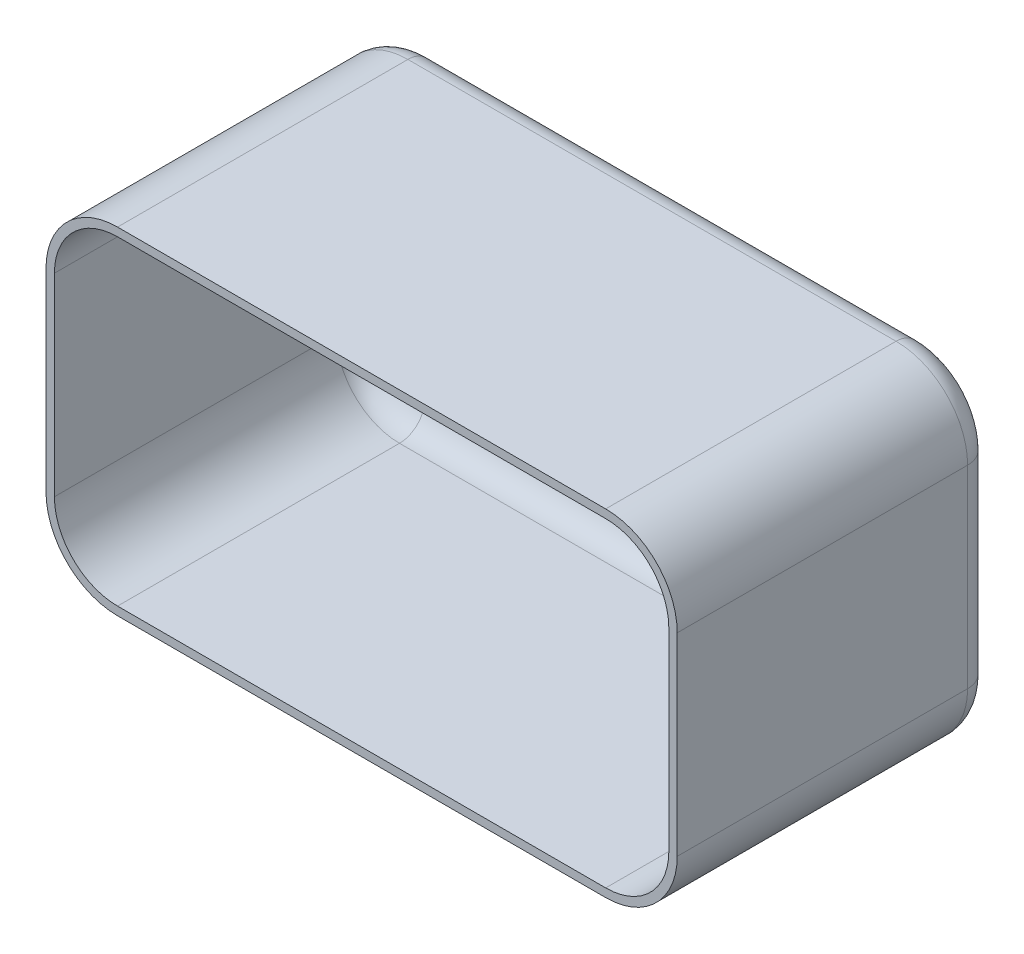
ISO-10303-21;
HEADER;
FILE_DESCRIPTION(('STEP AP214'),'2;1');
FILE_NAME('part.step','',(''),(''),'','','');
FILE_SCHEMA(('AUTOMOTIVE_DESIGN { 1 0 10303 214 1 1 1 1 }'));
ENDSEC;
DATA;
#1=APPLICATION_CONTEXT('core data for automotive mechanical design processes');
#2=APPLICATION_PROTOCOL_DEFINITION('international standard','automotive_design',2000,#1);
#3=PRODUCT_CONTEXT('',#1,'mechanical');
#4=PRODUCT('Part','Part','',(#3));
#5=PRODUCT_RELATED_PRODUCT_CATEGORY('part','',(#4));
#6=PRODUCT_DEFINITION_FORMATION('','',#4);
#7=PRODUCT_DEFINITION_CONTEXT('part definition',#1,'design');
#8=PRODUCT_DEFINITION('design','',#6,#7);
#9=PRODUCT_DEFINITION_SHAPE('','',#8);
#10=(LENGTH_UNIT() NAMED_UNIT(*) SI_UNIT(.MILLI.,.METRE.));
#11=(NAMED_UNIT(*) PLANE_ANGLE_UNIT() SI_UNIT($,.RADIAN.));
#12=(NAMED_UNIT(*) SI_UNIT($,.STERADIAN.) SOLID_ANGLE_UNIT());
#13=UNCERTAINTY_MEASURE_WITH_UNIT(LENGTH_MEASURE(1.E-05),#10,'distance_accuracy_value','');
#14=(GEOMETRIC_REPRESENTATION_CONTEXT(3) GLOBAL_UNCERTAINTY_ASSIGNED_CONTEXT((#13)) GLOBAL_UNIT_ASSIGNED_CONTEXT((#10,
#11,#12)) REPRESENTATION_CONTEXT('',''));
#15=CARTESIAN_POINT('',(0.,0.,0.));
#16=DIRECTION('',(0.,0.,1.));
#17=DIRECTION('',(1.,0.,0.));
#18=AXIS2_PLACEMENT_3D('',#15,#16,#17);
#19=CARTESIAN_POINT('',(-167.976460990203,129.257283518405,75.));
#20=DIRECTION('',(0.,0.,-1.));
#21=DIRECTION('',(-1.,0.,0.));
#22=AXIS2_PLACEMENT_3D('',#19,#20,#21);
#23=CYLINDRICAL_SURFACE('',#22,15.);
#24=DIRECTION('',(0.,0.,-1.));
#25=VECTOR('',#24,1.);
#26=CARTESIAN_POINT('',(-182.976460990203,129.257283518405,75.));
#27=LINE('',#26,#25);
#28=CARTESIAN_POINT('',(-182.976460990203,129.257283518405,75.));
#29=VERTEX_POINT('',#28);
#30=CARTESIAN_POINT('',(-182.976460990203,129.257283518405,7.99999999999999));
#31=VERTEX_POINT('',#30);
#32=EDGE_CURVE('E202',#29,#31,#27,.T.);
#33=ORIENTED_EDGE('',*,*,#32,.T.);
#34=CARTESIAN_POINT('',(-167.976460990203,129.257283518405,7.99999999999999));
#35=DIRECTION('',(0.,0.,-1.));
#36=DIRECTION('',(-1.,0.,0.));
#37=AXIS2_PLACEMENT_3D('',#34,#35,#36);
#38=CIRCLE('',#37,15.);
#39=CARTESIAN_POINT('',(-167.976460990203,144.257283518405,7.99999999999999));
#40=VERTEX_POINT('',#39);
#41=EDGE_CURVE('E347',#31,#40,#38,.T.);
#42=ORIENTED_EDGE('',*,*,#41,.T.);
#43=DIRECTION('',(0.,0.,-1.));
#44=VECTOR('',#43,1.);
#45=CARTESIAN_POINT('',(-167.976460990203,144.257283518405,75.));
#46=LINE('',#45,#44);
#47=CARTESIAN_POINT('',(-167.976460990203,144.257283518405,75.));
#48=VERTEX_POINT('',#47);
#49=EDGE_CURVE('E205',#48,#40,#46,.T.);
#50=ORIENTED_EDGE('',*,*,#49,.F.);
#51=CARTESIAN_POINT('',(-167.976460990203,129.257283518405,75.));
#52=DIRECTION('',(0.,0.,1.));
#53=DIRECTION('',(1.,0.,0.));
#54=AXIS2_PLACEMENT_3D('',#51,#52,#53);
#55=CIRCLE('',#54,15.);
#56=EDGE_CURVE('E200',#48,#29,#55,.T.);
#57=ORIENTED_EDGE('',*,*,#56,.T.);
#58=EDGE_LOOP('',(#33,#42,#50,#57));
#59=FACE_BOUND('',#58,.T.);
#60=ADVANCED_FACE('F35',(#59),#23,.F.);
#61=CARTESIAN_POINT('',(-182.976460990203,129.257283518405,75.));
#62=DIRECTION('',(1.,0.,0.));
#63=DIRECTION('',(0.,0.,-1.));
#64=AXIS2_PLACEMENT_3D('',#61,#62,#63);
#65=PLANE('',#64);
#66=DIRECTION('',(0.,0.,-1.));
#67=VECTOR('',#66,1.);
#68=CARTESIAN_POINT('',(-182.976460990203,83.257283518405,75.));
#69=LINE('',#68,#67);
#70=CARTESIAN_POINT('',(-182.976460990203,83.257283518405,75.));
#71=VERTEX_POINT('',#70);
#72=CARTESIAN_POINT('',(-182.976460990203,83.257283518405,7.99999999999999));
#73=VERTEX_POINT('',#72);
#74=EDGE_CURVE('E219',#71,#73,#69,.T.);
#75=ORIENTED_EDGE('',*,*,#74,.T.);
#76=DIRECTION('',(0.,1.,0.));
#77=VECTOR('',#76,1.);
#78=CARTESIAN_POINT('',(-182.976460990203,129.257283518405,7.99999999999999));
#79=LINE('',#78,#77);
#80=EDGE_CURVE('E217',#73,#31,#79,.T.);
#81=ORIENTED_EDGE('',*,*,#80,.T.);
#82=ORIENTED_EDGE('',*,*,#32,.F.);
#83=DIRECTION('',(0.,-1.,0.));
#84=VECTOR('',#83,1.);
#85=CARTESIAN_POINT('',(-182.976460990203,129.257283518405,75.));
#86=LINE('',#85,#84);
#87=EDGE_CURVE('E209',#29,#71,#86,.T.);
#88=ORIENTED_EDGE('',*,*,#87,.T.);
#89=EDGE_LOOP('',(#75,#81,#82,#88));
#90=FACE_BOUND('',#89,.T.);
#91=ADVANCED_FACE('F214',(#90),#65,.T.);
#92=CARTESIAN_POINT('',(-167.976460990203,83.257283518405,75.));
#93=DIRECTION('',(0.,0.,-1.));
#94=DIRECTION('',(-1.,0.,0.));
#95=AXIS2_PLACEMENT_3D('',#92,#93,#94);
#96=CYLINDRICAL_SURFACE('',#95,15.);
#97=DIRECTION('',(0.,0.,-1.));
#98=VECTOR('',#97,1.);
#99=CARTESIAN_POINT('',(-167.976460990203,68.257283518405,75.));
#100=LINE('',#99,#98);
#101=CARTESIAN_POINT('',(-167.976460990203,68.257283518405,75.));
#102=VERTEX_POINT('',#101);
#103=CARTESIAN_POINT('',(-167.976460990203,68.257283518405,7.99999999999999));
#104=VERTEX_POINT('',#103);
#105=EDGE_CURVE('E249',#102,#104,#100,.T.);
#106=ORIENTED_EDGE('',*,*,#105,.T.);
#107=CARTESIAN_POINT('',(-167.976460990203,83.257283518405,7.99999999999999));
#108=DIRECTION('',(0.,0.,-1.));
#109=DIRECTION('',(-1.,0.,0.));
#110=AXIS2_PLACEMENT_3D('',#107,#108,#109);
#111=CIRCLE('',#110,15.);
#112=EDGE_CURVE('E350',#104,#73,#111,.T.);
#113=ORIENTED_EDGE('',*,*,#112,.T.);
#114=ORIENTED_EDGE('',*,*,#74,.F.);
#115=CARTESIAN_POINT('',(-167.976460990203,83.257283518405,75.));
#116=DIRECTION('',(0.,0.,1.));
#117=DIRECTION('',(1.,0.,0.));
#118=AXIS2_PLACEMENT_3D('',#115,#116,#117);
#119=CIRCLE('',#118,15.);
#120=EDGE_CURVE('E224',#71,#102,#119,.T.);
#121=ORIENTED_EDGE('',*,*,#120,.T.);
#122=EDGE_LOOP('',(#106,#113,#114,#121));
#123=FACE_BOUND('',#122,.T.);
#124=ADVANCED_FACE('F453',(#123),#96,.F.);
#125=CARTESIAN_POINT('',(-167.976460990203,68.257283518405,75.));
#126=DIRECTION('',(0.,1.,0.));
#127=DIRECTION('',(0.,0.,1.));
#128=AXIS2_PLACEMENT_3D('',#125,#126,#127);
#129=PLANE('',#128);
#130=DIRECTION('',(0.,0.,-1.));
#131=VECTOR('',#130,1.);
#132=CARTESIAN_POINT('',(-51.9764609902031,68.257283518405,75.));
#133=LINE('',#132,#131);
#134=CARTESIAN_POINT('',(-51.9764609902031,68.257283518405,75.));
#135=VERTEX_POINT('',#134);
#136=CARTESIAN_POINT('',(-51.9764609902031,68.257283518405,7.99999999999999));
#137=VERTEX_POINT('',#136);
#138=EDGE_CURVE('E247',#135,#137,#133,.T.);
#139=ORIENTED_EDGE('',*,*,#138,.T.);
#140=DIRECTION('',(-1.,0.,0.));
#141=VECTOR('',#140,1.);
#142=CARTESIAN_POINT('',(-167.976460990203,68.257283518405,7.99999999999999));
#143=LINE('',#142,#141);
#144=EDGE_CURVE('E352',#137,#104,#143,.T.);
#145=ORIENTED_EDGE('',*,*,#144,.T.);
#146=ORIENTED_EDGE('',*,*,#105,.F.);
#147=DIRECTION('',(1.,0.,0.));
#148=VECTOR('',#147,1.);
#149=CARTESIAN_POINT('',(-167.976460990203,68.257283518405,75.));
#150=LINE('',#149,#148);
#151=EDGE_CURVE('E226',#102,#135,#150,.T.);
#152=ORIENTED_EDGE('',*,*,#151,.T.);
#153=EDGE_LOOP('',(#139,#145,#146,#152));
#154=FACE_BOUND('',#153,.T.);
#155=ADVANCED_FACE('F580',(#154),#129,.T.);
#156=CARTESIAN_POINT('',(-51.9764609902031,83.257283518405,75.));
#157=DIRECTION('',(0.,0.,-1.));
#158=DIRECTION('',(-1.,0.,0.));
#159=AXIS2_PLACEMENT_3D('',#156,#157,#158);
#160=CYLINDRICAL_SURFACE('',#159,15.);
#161=DIRECTION('',(0.,0.,-1.));
#162=VECTOR('',#161,1.);
#163=CARTESIAN_POINT('',(-36.9764609902031,83.257283518405,75.));
#164=LINE('',#163,#162);
#165=CARTESIAN_POINT('',(-36.9764609902031,83.257283518405,75.));
#166=VERTEX_POINT('',#165);
#167=CARTESIAN_POINT('',(-36.9764609902031,83.257283518405,7.99999999999999));
#168=VERTEX_POINT('',#167);
#169=EDGE_CURVE('E245',#166,#168,#164,.T.);
#170=ORIENTED_EDGE('',*,*,#169,.T.);
#171=CARTESIAN_POINT('',(-51.9764609902031,83.257283518405,7.99999999999999));
#172=DIRECTION('',(0.,0.,-1.));
#173=DIRECTION('',(-1.,0.,0.));
#174=AXIS2_PLACEMENT_3D('',#171,#172,#173);
#175=CIRCLE('',#174,15.);
#176=EDGE_CURVE('E57',#168,#137,#175,.T.);
#177=ORIENTED_EDGE('',*,*,#176,.T.);
#178=ORIENTED_EDGE('',*,*,#138,.F.);
#179=CARTESIAN_POINT('',(-51.9764609902031,83.257283518405,75.));
#180=DIRECTION('',(0.,0.,1.));
#181=DIRECTION('',(1.,0.,0.));
#182=AXIS2_PLACEMENT_3D('',#179,#180,#181);
#183=CIRCLE('',#182,15.);
#184=EDGE_CURVE('E230',#135,#166,#183,.T.);
#185=ORIENTED_EDGE('',*,*,#184,.T.);
#186=EDGE_LOOP('',(#170,#177,#178,#185));
#187=FACE_BOUND('',#186,.T.);
#188=ADVANCED_FACE('F429',(#187),#160,.F.);
#189=CARTESIAN_POINT('',(-36.9764609902031,129.257283518405,75.));
#190=DIRECTION('',(-1.,0.,0.));
#191=DIRECTION('',(0.,-1.,0.));
#192=AXIS2_PLACEMENT_3D('',#189,#190,#191);
#193=PLANE('',#192);
#194=DIRECTION('',(0.,0.,-1.));
#195=VECTOR('',#194,1.);
#196=CARTESIAN_POINT('',(-36.9764609902031,129.257283518405,75.));
#197=LINE('',#196,#195);
#198=CARTESIAN_POINT('',(-36.9764609902031,129.257283518405,75.));
#199=VERTEX_POINT('',#198);
#200=CARTESIAN_POINT('',(-36.9764609902031,129.257283518405,7.99999999999999));
#201=VERTEX_POINT('',#200);
#202=EDGE_CURVE('E243',#199,#201,#197,.T.);
#203=ORIENTED_EDGE('',*,*,#202,.T.);
#204=DIRECTION('',(0.,-1.,0.));
#205=VECTOR('',#204,1.);
#206=CARTESIAN_POINT('',(-36.9764609902031,129.257283518405,7.99999999999999));
#207=LINE('',#206,#205);
#208=EDGE_CURVE('E11',#201,#168,#207,.T.);
#209=ORIENTED_EDGE('',*,*,#208,.T.);
#210=ORIENTED_EDGE('',*,*,#169,.F.);
#211=DIRECTION('',(0.,1.,0.));
#212=VECTOR('',#211,1.);
#213=CARTESIAN_POINT('',(-36.9764609902031,129.257283518405,75.));
#214=LINE('',#213,#212);
#215=EDGE_CURVE('E232',#166,#199,#214,.T.);
#216=ORIENTED_EDGE('',*,*,#215,.T.);
#217=EDGE_LOOP('',(#203,#209,#210,#216));
#218=FACE_BOUND('',#217,.T.);
#219=ADVANCED_FACE('F428',(#218),#193,.T.);
#220=CARTESIAN_POINT('',(-51.9764609902031,129.257283518405,75.));
#221=DIRECTION('',(0.,0.,-1.));
#222=DIRECTION('',(-1.,0.,0.));
#223=AXIS2_PLACEMENT_3D('',#220,#221,#222);
#224=CYLINDRICAL_SURFACE('',#223,15.);
#225=DIRECTION('',(0.,0.,-1.));
#226=VECTOR('',#225,1.);
#227=CARTESIAN_POINT('',(-51.9764609902031,144.257283518405,75.));
#228=LINE('',#227,#226);
#229=CARTESIAN_POINT('',(-51.9764609902031,144.257283518405,75.));
#230=VERTEX_POINT('',#229);
#231=CARTESIAN_POINT('',(-51.9764609902031,144.257283518405,7.99999999999999));
#232=VERTEX_POINT('',#231);
#233=EDGE_CURVE('E240',#230,#232,#228,.T.);
#234=ORIENTED_EDGE('',*,*,#233,.T.);
#235=CARTESIAN_POINT('',(-51.9764609902031,129.257283518405,7.99999999999999));
#236=DIRECTION('',(0.,0.,-1.));
#237=DIRECTION('',(-1.,0.,0.));
#238=AXIS2_PLACEMENT_3D('',#235,#236,#237);
#239=CIRCLE('',#238,15.);
#240=EDGE_CURVE('E325',#232,#201,#239,.T.);
#241=ORIENTED_EDGE('',*,*,#240,.T.);
#242=ORIENTED_EDGE('',*,*,#202,.F.);
#243=CARTESIAN_POINT('',(-51.9764609902031,129.257283518405,75.));
#244=DIRECTION('',(0.,0.,1.));
#245=DIRECTION('',(-1.,0.,0.));
#246=AXIS2_PLACEMENT_3D('',#243,#244,#245);
#247=CIRCLE('',#246,15.);
#248=EDGE_CURVE('E234',#199,#230,#247,.T.);
#249=ORIENTED_EDGE('',*,*,#248,.T.);
#250=EDGE_LOOP('',(#234,#241,#242,#249));
#251=FACE_BOUND('',#250,.T.);
#252=ADVANCED_FACE('F423',(#251),#224,.F.);
#253=CARTESIAN_POINT('',(-167.976460990203,144.257283518405,75.));
#254=DIRECTION('',(0.,-1.,0.));
#255=DIRECTION('',(0.,0.,-1.));
#256=AXIS2_PLACEMENT_3D('',#253,#254,#255);
#257=PLANE('',#256);
#258=ORIENTED_EDGE('',*,*,#49,.T.);
#259=DIRECTION('',(1.,0.,0.));
#260=VECTOR('',#259,1.);
#261=CARTESIAN_POINT('',(-167.976460990203,144.257283518405,7.99999999999999));
#262=LINE('',#261,#260);
#263=EDGE_CURVE('E345',#40,#232,#262,.T.);
#264=ORIENTED_EDGE('',*,*,#263,.T.);
#265=ORIENTED_EDGE('',*,*,#233,.F.);
#266=DIRECTION('',(-1.,0.,0.));
#267=VECTOR('',#266,1.);
#268=CARTESIAN_POINT('',(-167.976460990203,144.257283518405,75.));
#269=LINE('',#268,#267);
#270=EDGE_CURVE('E237',#230,#48,#269,.T.);
#271=ORIENTED_EDGE('',*,*,#270,.T.);
#272=EDGE_LOOP('',(#258,#264,#265,#271));
#273=FACE_BOUND('',#272,.T.);
#274=ADVANCED_FACE('F421',(#273),#257,.T.);
#275=CARTESIAN_POINT('',(-51.9764609902031,129.257283518405,75.));
#276=DIRECTION('',(0.,0.,-1.));
#277=DIRECTION('',(-1.,0.,0.));
#278=AXIS2_PLACEMENT_3D('',#275,#276,#277);
#279=PLANE('',#278);
#280=CARTESIAN_POINT('',(-51.9764609902031,129.257283518405,75.));
#281=DIRECTION('',(0.,0.,1.));
#282=DIRECTION('',(-1.,0.,0.));
#283=AXIS2_PLACEMENT_3D('',#280,#281,#282);
#284=CIRCLE('',#283,17.);
#285=CARTESIAN_POINT('',(-34.9764609902031,129.257283518405,75.));
#286=VERTEX_POINT('',#285);
#287=CARTESIAN_POINT('',(-51.9764609902031,146.257283518405,75.));
#288=VERTEX_POINT('',#287);
#289=EDGE_CURVE('E218',#286,#288,#284,.T.);
#290=ORIENTED_EDGE('',*,*,#289,.T.);
#291=DIRECTION('',(-1.,0.,0.));
#292=VECTOR('',#291,1.);
#293=CARTESIAN_POINT('',(-167.976460990203,146.257283518405,75.));
#294=LINE('',#293,#292);
#295=CARTESIAN_POINT('',(-167.976460990203,146.257283518405,75.));
#296=VERTEX_POINT('',#295);
#297=EDGE_CURVE('E255',#288,#296,#294,.T.);
#298=ORIENTED_EDGE('',*,*,#297,.T.);
#299=CARTESIAN_POINT('',(-167.976460990203,129.257283518405,75.));
#300=DIRECTION('',(0.,0.,1.));
#301=DIRECTION('',(1.,0.,0.));
#302=AXIS2_PLACEMENT_3D('',#299,#300,#301);
#303=CIRCLE('',#302,17.);
#304=CARTESIAN_POINT('',(-184.976460990203,129.257283518405,75.));
#305=VERTEX_POINT('',#304);
#306=EDGE_CURVE('E257',#296,#305,#303,.T.);
#307=ORIENTED_EDGE('',*,*,#306,.T.);
#308=DIRECTION('',(0.,-1.,0.));
#309=VECTOR('',#308,1.);
#310=CARTESIAN_POINT('',(-184.976460990203,129.257283518405,75.));
#311=LINE('',#310,#309);
#312=CARTESIAN_POINT('',(-184.976460990203,83.257283518405,75.));
#313=VERTEX_POINT('',#312);
#314=EDGE_CURVE('E259',#305,#313,#311,.T.);
#315=ORIENTED_EDGE('',*,*,#314,.T.);
#316=CARTESIAN_POINT('',(-167.976460990203,83.257283518405,75.));
#317=DIRECTION('',(0.,0.,1.));
#318=DIRECTION('',(1.,0.,0.));
#319=AXIS2_PLACEMENT_3D('',#316,#317,#318);
#320=CIRCLE('',#319,17.);
#321=CARTESIAN_POINT('',(-167.976460990203,66.257283518405,75.));
#322=VERTEX_POINT('',#321);
#323=EDGE_CURVE('E261',#313,#322,#320,.T.);
#324=ORIENTED_EDGE('',*,*,#323,.T.);
#325=DIRECTION('',(1.,0.,0.));
#326=VECTOR('',#325,1.);
#327=CARTESIAN_POINT('',(-167.976460990203,66.257283518405,75.));
#328=LINE('',#327,#326);
#329=CARTESIAN_POINT('',(-51.9764609902031,66.257283518405,75.));
#330=VERTEX_POINT('',#329);
#331=EDGE_CURVE('E263',#322,#330,#328,.T.);
#332=ORIENTED_EDGE('',*,*,#331,.T.);
#333=CARTESIAN_POINT('',(-51.9764609902031,83.257283518405,75.));
#334=DIRECTION('',(0.,0.,1.));
#335=DIRECTION('',(1.,0.,0.));
#336=AXIS2_PLACEMENT_3D('',#333,#334,#335);
#337=CIRCLE('',#336,17.);
#338=CARTESIAN_POINT('',(-34.9764609902031,83.257283518405,75.));
#339=VERTEX_POINT('',#338);
#340=EDGE_CURVE('E265',#330,#339,#337,.T.);
#341=ORIENTED_EDGE('',*,*,#340,.T.);
#342=DIRECTION('',(0.,1.,0.));
#343=VECTOR('',#342,1.);
#344=CARTESIAN_POINT('',(-34.9764609902031,129.257283518405,75.));
#345=LINE('',#344,#343);
#346=EDGE_CURVE('E267',#339,#286,#345,.T.);
#347=ORIENTED_EDGE('',*,*,#346,.T.);
#348=EDGE_LOOP('',(#290,#298,#307,#315,#324,#332,#341,#347));
#349=FACE_BOUND('',#348,.T.);
#350=ORIENTED_EDGE('',*,*,#56,.F.);
#351=ORIENTED_EDGE('',*,*,#270,.F.);
#352=ORIENTED_EDGE('',*,*,#248,.F.);
#353=ORIENTED_EDGE('',*,*,#215,.F.);
#354=ORIENTED_EDGE('',*,*,#184,.F.);
#355=ORIENTED_EDGE('',*,*,#151,.F.);
#356=ORIENTED_EDGE('',*,*,#120,.F.);
#357=ORIENTED_EDGE('',*,*,#87,.F.);
#358=EDGE_LOOP('',(#350,#351,#352,#353,#354,#355,#356,#357));
#359=FACE_BOUND('',#358,.T.);
#360=ADVANCED_FACE('F222',(#349,#359),#279,.F.);
#361=CARTESIAN_POINT('',(-51.9764609902031,129.257283518405,0.));
#362=DIRECTION('',(0.,0.,-1.));
#363=DIRECTION('',(-1.,0.,0.));
#364=AXIS2_PLACEMENT_3D('',#361,#362,#363);
#365=PLANE('',#364);
#366=DIRECTION('',(0.,1.,0.));
#367=VECTOR('',#366,1.);
#368=CARTESIAN_POINT('',(-40.9764609902031,83.257283518405,0.));
#369=LINE('',#368,#367);
#370=CARTESIAN_POINT('',(-40.9764609902031,129.257283518405,0.));
#371=VERTEX_POINT('',#370);
#372=CARTESIAN_POINT('',(-40.9764609902031,83.257283518405,0.));
#373=VERTEX_POINT('',#372);
#374=EDGE_CURVE('E296',#371,#373,#369,.F.);
#375=ORIENTED_EDGE('',*,*,#374,.T.);
#376=CARTESIAN_POINT('',(-51.9764609902031,83.257283518405,0.));
#377=DIRECTION('',(0.,0.,-1.));
#378=DIRECTION('',(-1.,0.,0.));
#379=AXIS2_PLACEMENT_3D('',#376,#377,#378);
#380=CIRCLE('',#379,11.);
#381=CARTESIAN_POINT('',(-51.9764609902031,72.257283518405,0.));
#382=VERTEX_POINT('',#381);
#383=EDGE_CURVE('E310',#373,#382,#380,.T.);
#384=ORIENTED_EDGE('',*,*,#383,.T.);
#385=DIRECTION('',(1.,0.,0.));
#386=VECTOR('',#385,1.);
#387=CARTESIAN_POINT('',(-167.976460990203,72.257283518405,0.));
#388=LINE('',#387,#386);
#389=CARTESIAN_POINT('',(-167.976460990203,72.257283518405,0.));
#390=VERTEX_POINT('',#389);
#391=EDGE_CURVE('E308',#382,#390,#388,.F.);
#392=ORIENTED_EDGE('',*,*,#391,.T.);
#393=CARTESIAN_POINT('',(-167.976460990203,83.257283518405,0.));
#394=DIRECTION('',(0.,0.,-1.));
#395=DIRECTION('',(-1.,0.,0.));
#396=AXIS2_PLACEMENT_3D('',#393,#394,#395);
#397=CIRCLE('',#396,11.);
#398=CARTESIAN_POINT('',(-178.976460990203,83.257283518405,0.));
#399=VERTEX_POINT('',#398);
#400=EDGE_CURVE('E306',#390,#399,#397,.T.);
#401=ORIENTED_EDGE('',*,*,#400,.T.);
#402=DIRECTION('',(0.,-1.,0.));
#403=VECTOR('',#402,1.);
#404=CARTESIAN_POINT('',(-178.976460990203,129.257283518405,0.));
#405=LINE('',#404,#403);
#406=CARTESIAN_POINT('',(-178.976460990203,129.257283518405,0.));
#407=VERTEX_POINT('',#406);
#408=EDGE_CURVE('E304',#399,#407,#405,.F.);
#409=ORIENTED_EDGE('',*,*,#408,.T.);
#410=CARTESIAN_POINT('',(-167.976460990203,129.257283518405,0.));
#411=DIRECTION('',(0.,0.,-1.));
#412=DIRECTION('',(-1.,0.,0.));
#413=AXIS2_PLACEMENT_3D('',#410,#411,#412);
#414=CIRCLE('',#413,11.);
#415=CARTESIAN_POINT('',(-167.976460990203,140.257283518405,0.));
#416=VERTEX_POINT('',#415);
#417=EDGE_CURVE('E302',#407,#416,#414,.T.);
#418=ORIENTED_EDGE('',*,*,#417,.T.);
#419=DIRECTION('',(-1.,0.,0.));
#420=VECTOR('',#419,1.);
#421=CARTESIAN_POINT('',(-51.9764609902031,140.257283518405,0.));
#422=LINE('',#421,#420);
#423=CARTESIAN_POINT('',(-51.9764609902031,140.257283518405,0.));
#424=VERTEX_POINT('',#423);
#425=EDGE_CURVE('E300',#416,#424,#422,.F.);
#426=ORIENTED_EDGE('',*,*,#425,.T.);
#427=CARTESIAN_POINT('',(-51.9764609902031,129.257283518405,0.));
#428=DIRECTION('',(0.,0.,-1.));
#429=DIRECTION('',(-1.,0.,0.));
#430=AXIS2_PLACEMENT_3D('',#427,#428,#429);
#431=CIRCLE('',#430,11.);
#432=EDGE_CURVE('E298',#424,#371,#431,.T.);
#433=ORIENTED_EDGE('',*,*,#432,.T.);
#434=EDGE_LOOP('',(#375,#384,#392,#401,#409,#418,#426,#433));
#435=FACE_BOUND('',#434,.T.);
#436=ADVANCED_FACE('F459',(#435),#365,.T.);
#437=CARTESIAN_POINT('',(-51.9764609902031,129.257283518405,75.));
#438=DIRECTION('',(0.,0.,-1.));
#439=DIRECTION('',(-1.,0.,0.));
#440=AXIS2_PLACEMENT_3D('',#437,#438,#439);
#441=CYLINDRICAL_SURFACE('',#440,17.);
#442=DIRECTION('',(0.,0.,-1.));
#443=VECTOR('',#442,1.);
#444=CARTESIAN_POINT('',(-34.9764609902031,129.257283518405,75.));
#445=LINE('',#444,#443);
#446=CARTESIAN_POINT('',(-34.9764609902031,129.257283518405,6.00000000000001));
#447=VERTEX_POINT('',#446);
#448=EDGE_CURVE('E269',#286,#447,#445,.T.);
#449=ORIENTED_EDGE('',*,*,#448,.T.);
#450=CARTESIAN_POINT('',(-51.9764609902031,129.257283518405,6.00000000000001));
#451=DIRECTION('',(0.,0.,-1.));
#452=DIRECTION('',(-1.,0.,0.));
#453=AXIS2_PLACEMENT_3D('',#450,#451,#452);
#454=CIRCLE('',#453,17.);
#455=CARTESIAN_POINT('',(-51.9764609902031,146.257283518405,6.00000000000001));
#456=VERTEX_POINT('',#455);
#457=EDGE_CURVE('E323',#447,#456,#454,.F.);
#458=ORIENTED_EDGE('',*,*,#457,.T.);
#459=DIRECTION('',(0.,0.,-1.));
#460=VECTOR('',#459,1.);
#461=CARTESIAN_POINT('',(-51.9764609902031,146.257283518405,75.));
#462=LINE('',#461,#460);
#463=EDGE_CURVE('E290',#288,#456,#462,.T.);
#464=ORIENTED_EDGE('',*,*,#463,.F.);
#465=ORIENTED_EDGE('',*,*,#289,.F.);
#466=EDGE_LOOP('',(#449,#458,#464,#465));
#467=FACE_BOUND('',#466,.T.);
#468=ADVANCED_FACE('F463',(#467),#441,.T.);
#469=CARTESIAN_POINT('',(-167.976460990203,146.257283518405,75.));
#470=DIRECTION('',(0.,-1.,0.));
#471=DIRECTION('',(0.,0.,-1.));
#472=AXIS2_PLACEMENT_3D('',#469,#470,#471);
#473=PLANE('',#472);
#474=ORIENTED_EDGE('',*,*,#463,.T.);
#475=DIRECTION('',(-1.,0.,0.));
#476=VECTOR('',#475,1.);
#477=CARTESIAN_POINT('',(-167.976460990203,146.257283518405,6.00000000000001));
#478=LINE('',#477,#476);
#479=CARTESIAN_POINT('',(-167.976460990203,146.257283518405,6.00000000000001));
#480=VERTEX_POINT('',#479);
#481=EDGE_CURVE('E321',#456,#480,#478,.T.);
#482=ORIENTED_EDGE('',*,*,#481,.T.);
#483=DIRECTION('',(0.,0.,-1.));
#484=VECTOR('',#483,1.);
#485=CARTESIAN_POINT('',(-167.976460990203,146.257283518405,75.));
#486=LINE('',#485,#484);
#487=EDGE_CURVE('E287',#296,#480,#486,.T.);
#488=ORIENTED_EDGE('',*,*,#487,.F.);
#489=ORIENTED_EDGE('',*,*,#297,.F.);
#490=EDGE_LOOP('',(#474,#482,#488,#489));
#491=FACE_BOUND('',#490,.T.);
#492=ADVANCED_FACE('F488',(#491),#473,.F.);
#493=CARTESIAN_POINT('',(-167.976460990203,129.257283518405,75.));
#494=DIRECTION('',(0.,0.,-1.));
#495=DIRECTION('',(-1.,0.,0.));
#496=AXIS2_PLACEMENT_3D('',#493,#494,#495);
#497=CYLINDRICAL_SURFACE('',#496,17.);
#498=ORIENTED_EDGE('',*,*,#487,.T.);
#499=CARTESIAN_POINT('',(-167.976460990203,129.257283518405,6.00000000000001));
#500=DIRECTION('',(0.,0.,-1.));
#501=DIRECTION('',(-1.,0.,0.));
#502=AXIS2_PLACEMENT_3D('',#499,#500,#501);
#503=CIRCLE('',#502,17.);
#504=CARTESIAN_POINT('',(-184.976460990203,129.257283518405,6.00000000000001));
#505=VERTEX_POINT('',#504);
#506=EDGE_CURVE('E319',#480,#505,#503,.F.);
#507=ORIENTED_EDGE('',*,*,#506,.T.);
#508=DIRECTION('',(0.,0.,-1.));
#509=VECTOR('',#508,1.);
#510=CARTESIAN_POINT('',(-184.976460990203,129.257283518405,75.));
#511=LINE('',#510,#509);
#512=EDGE_CURVE('E284',#305,#505,#511,.T.);
#513=ORIENTED_EDGE('',*,*,#512,.F.);
#514=ORIENTED_EDGE('',*,*,#306,.F.);
#515=EDGE_LOOP('',(#498,#507,#513,#514));
#516=FACE_BOUND('',#515,.T.);
#517=ADVANCED_FACE('F484',(#516),#497,.T.);
#518=CARTESIAN_POINT('',(-184.976460990203,129.257283518405,75.));
#519=DIRECTION('',(1.,0.,0.));
#520=DIRECTION('',(0.,0.,-1.));
#521=AXIS2_PLACEMENT_3D('',#518,#519,#520);
#522=PLANE('',#521);
#523=ORIENTED_EDGE('',*,*,#512,.T.);
#524=DIRECTION('',(0.,-1.,0.));
#525=VECTOR('',#524,1.);
#526=CARTESIAN_POINT('',(-184.976460990203,83.257283518405,6.00000000000001));
#527=LINE('',#526,#525);
#528=CARTESIAN_POINT('',(-184.976460990203,83.257283518405,6.00000000000001));
#529=VERTEX_POINT('',#528);
#530=EDGE_CURVE('E317',#505,#529,#527,.T.);
#531=ORIENTED_EDGE('',*,*,#530,.T.);
#532=DIRECTION('',(0.,0.,-1.));
#533=VECTOR('',#532,1.);
#534=CARTESIAN_POINT('',(-184.976460990203,83.257283518405,75.));
#535=LINE('',#534,#533);
#536=EDGE_CURVE('E281',#313,#529,#535,.T.);
#537=ORIENTED_EDGE('',*,*,#536,.F.);
#538=ORIENTED_EDGE('',*,*,#314,.F.);
#539=EDGE_LOOP('',(#523,#531,#537,#538));
#540=FACE_BOUND('',#539,.T.);
#541=ADVANCED_FACE('F480',(#540),#522,.F.);
#542=CARTESIAN_POINT('',(-167.976460990203,83.257283518405,75.));
#543=DIRECTION('',(0.,0.,-1.));
#544=DIRECTION('',(-1.,0.,0.));
#545=AXIS2_PLACEMENT_3D('',#542,#543,#544);
#546=CYLINDRICAL_SURFACE('',#545,17.);
#547=ORIENTED_EDGE('',*,*,#536,.T.);
#548=CARTESIAN_POINT('',(-167.976460990203,83.257283518405,6.00000000000001));
#549=DIRECTION('',(0.,0.,-1.));
#550=DIRECTION('',(-1.,0.,0.));
#551=AXIS2_PLACEMENT_3D('',#548,#549,#550);
#552=CIRCLE('',#551,17.);
#553=CARTESIAN_POINT('',(-167.976460990203,66.257283518405,6.00000000000001));
#554=VERTEX_POINT('',#553);
#555=EDGE_CURVE('E315',#529,#554,#552,.F.);
#556=ORIENTED_EDGE('',*,*,#555,.T.);
#557=DIRECTION('',(0.,0.,-1.));
#558=VECTOR('',#557,1.);
#559=CARTESIAN_POINT('',(-167.976460990203,66.257283518405,75.));
#560=LINE('',#559,#558);
#561=EDGE_CURVE('E278',#322,#554,#560,.T.);
#562=ORIENTED_EDGE('',*,*,#561,.F.);
#563=ORIENTED_EDGE('',*,*,#323,.F.);
#564=EDGE_LOOP('',(#547,#556,#562,#563));
#565=FACE_BOUND('',#564,.T.);
#566=ADVANCED_FACE('F476',(#565),#546,.T.);
#567=CARTESIAN_POINT('',(-167.976460990203,66.257283518405,75.));
#568=DIRECTION('',(0.,1.,0.));
#569=DIRECTION('',(-1.,0.,0.));
#570=AXIS2_PLACEMENT_3D('',#567,#568,#569);
#571=PLANE('',#570);
#572=ORIENTED_EDGE('',*,*,#561,.T.);
#573=DIRECTION('',(1.,0.,0.));
#574=VECTOR('',#573,1.);
#575=CARTESIAN_POINT('',(-51.9764609902031,66.257283518405,6.00000000000001));
#576=LINE('',#575,#574);
#577=CARTESIAN_POINT('',(-51.9764609902031,66.257283518405,6.00000000000001));
#578=VERTEX_POINT('',#577);
#579=EDGE_CURVE('E313',#554,#578,#576,.T.);
#580=ORIENTED_EDGE('',*,*,#579,.T.);
#581=DIRECTION('',(0.,0.,-1.));
#582=VECTOR('',#581,1.);
#583=CARTESIAN_POINT('',(-51.9764609902031,66.257283518405,75.));
#584=LINE('',#583,#582);
#585=EDGE_CURVE('E275',#330,#578,#584,.T.);
#586=ORIENTED_EDGE('',*,*,#585,.F.);
#587=ORIENTED_EDGE('',*,*,#331,.F.);
#588=EDGE_LOOP('',(#572,#580,#586,#587));
#589=FACE_BOUND('',#588,.T.);
#590=ADVANCED_FACE('F472',(#589),#571,.F.);
#591=CARTESIAN_POINT('',(-51.9764609902031,83.257283518405,75.));
#592=DIRECTION('',(0.,0.,-1.));
#593=DIRECTION('',(-1.,0.,0.));
#594=AXIS2_PLACEMENT_3D('',#591,#592,#593);
#595=CYLINDRICAL_SURFACE('',#594,17.);
#596=ORIENTED_EDGE('',*,*,#585,.T.);
#597=CARTESIAN_POINT('',(-51.9764609902031,83.257283518405,6.00000000000001));
#598=DIRECTION('',(0.,0.,-1.));
#599=DIRECTION('',(-1.,0.,0.));
#600=AXIS2_PLACEMENT_3D('',#597,#598,#599);
#601=CIRCLE('',#600,17.);
#602=CARTESIAN_POINT('',(-34.9764609902031,83.257283518405,6.00000000000001));
#603=VERTEX_POINT('',#602);
#604=EDGE_CURVE('E293',#578,#603,#601,.F.);
#605=ORIENTED_EDGE('',*,*,#604,.T.);
#606=DIRECTION('',(0.,0.,-1.));
#607=VECTOR('',#606,1.);
#608=CARTESIAN_POINT('',(-34.9764609902031,83.257283518405,75.));
#609=LINE('',#608,#607);
#610=EDGE_CURVE('E272',#339,#603,#609,.T.);
#611=ORIENTED_EDGE('',*,*,#610,.F.);
#612=ORIENTED_EDGE('',*,*,#340,.F.);
#613=EDGE_LOOP('',(#596,#605,#611,#612));
#614=FACE_BOUND('',#613,.T.);
#615=ADVANCED_FACE('F468',(#614),#595,.T.);
#616=CARTESIAN_POINT('',(-34.9764609902031,129.257283518405,75.));
#617=DIRECTION('',(-1.,0.,0.));
#618=DIRECTION('',(0.,-1.,0.));
#619=AXIS2_PLACEMENT_3D('',#616,#617,#618);
#620=PLANE('',#619);
#621=ORIENTED_EDGE('',*,*,#610,.T.);
#622=DIRECTION('',(0.,1.,0.));
#623=VECTOR('',#622,1.);
#624=CARTESIAN_POINT('',(-34.9764609902031,129.257283518405,6.00000000000001));
#625=LINE('',#624,#623);
#626=EDGE_CURVE('E44',#603,#447,#625,.T.);
#627=ORIENTED_EDGE('',*,*,#626,.T.);
#628=ORIENTED_EDGE('',*,*,#448,.F.);
#629=ORIENTED_EDGE('',*,*,#346,.F.);
#630=EDGE_LOOP('',(#621,#627,#628,#629));
#631=FACE_BOUND('',#630,.T.);
#632=ADVANCED_FACE('F465',(#631),#620,.F.);
#633=CARTESIAN_POINT('',(-51.9764609902031,129.257283518405,2.));
#634=DIRECTION('',(0.,0.,-1.));
#635=DIRECTION('',(-1.,0.,0.));
#636=AXIS2_PLACEMENT_3D('',#633,#634,#635);
#637=PLANE('',#636);
#638=DIRECTION('',(0.,-1.,0.));
#639=VECTOR('',#638,1.);
#640=CARTESIAN_POINT('',(-42.9764609902031,129.257283518405,2.));
#641=LINE('',#640,#639);
#642=CARTESIAN_POINT('',(-42.9764609902031,83.257283518405,2.));
#643=VERTEX_POINT('',#642);
#644=CARTESIAN_POINT('',(-42.9764609902031,129.257283518405,2.));
#645=VERTEX_POINT('',#644);
#646=EDGE_CURVE('E328',#643,#645,#641,.F.);
#647=ORIENTED_EDGE('',*,*,#646,.T.);
#648=CARTESIAN_POINT('',(-51.9764609902031,129.257283518405,2.));
#649=DIRECTION('',(0.,0.,-1.));
#650=DIRECTION('',(-1.,0.,0.));
#651=AXIS2_PLACEMENT_3D('',#648,#649,#650);
#652=CIRCLE('',#651,9.00000000000001);
#653=CARTESIAN_POINT('',(-51.9764609902031,138.257283518405,2.));
#654=VERTEX_POINT('',#653);
#655=EDGE_CURVE('E342',#645,#654,#652,.F.);
#656=ORIENTED_EDGE('',*,*,#655,.T.);
#657=DIRECTION('',(1.,0.,0.));
#658=VECTOR('',#657,1.);
#659=CARTESIAN_POINT('',(-51.9764609902031,138.257283518405,2.));
#660=LINE('',#659,#658);
#661=CARTESIAN_POINT('',(-167.976460990203,138.257283518405,2.));
#662=VERTEX_POINT('',#661);
#663=EDGE_CURVE('E340',#654,#662,#660,.F.);
#664=ORIENTED_EDGE('',*,*,#663,.T.);
#665=CARTESIAN_POINT('',(-167.976460990203,129.257283518405,2.));
#666=DIRECTION('',(0.,0.,-1.));
#667=DIRECTION('',(-1.,0.,0.));
#668=AXIS2_PLACEMENT_3D('',#665,#666,#667);
#669=CIRCLE('',#668,9.00000000000001);
#670=CARTESIAN_POINT('',(-176.976460990203,129.257283518405,2.));
#671=VERTEX_POINT('',#670);
#672=EDGE_CURVE('E338',#662,#671,#669,.F.);
#673=ORIENTED_EDGE('',*,*,#672,.T.);
#674=DIRECTION('',(0.,1.,0.));
#675=VECTOR('',#674,1.);
#676=CARTESIAN_POINT('',(-176.976460990203,129.257283518405,2.));
#677=LINE('',#676,#675);
#678=CARTESIAN_POINT('',(-176.976460990203,83.257283518405,2.));
#679=VERTEX_POINT('',#678);
#680=EDGE_CURVE('E336',#671,#679,#677,.F.);
#681=ORIENTED_EDGE('',*,*,#680,.T.);
#682=CARTESIAN_POINT('',(-167.976460990203,83.257283518405,2.));
#683=DIRECTION('',(0.,0.,-1.));
#684=DIRECTION('',(-1.,0.,0.));
#685=AXIS2_PLACEMENT_3D('',#682,#683,#684);
#686=CIRCLE('',#685,9.00000000000001);
#687=CARTESIAN_POINT('',(-167.976460990203,74.257283518405,2.));
#688=VERTEX_POINT('',#687);
#689=EDGE_CURVE('E334',#679,#688,#686,.F.);
#690=ORIENTED_EDGE('',*,*,#689,.T.);
#691=DIRECTION('',(-1.,0.,0.));
#692=VECTOR('',#691,1.);
#693=CARTESIAN_POINT('',(-51.9764609902031,74.257283518405,2.));
#694=LINE('',#693,#692);
#695=CARTESIAN_POINT('',(-51.9764609902031,74.257283518405,2.));
#696=VERTEX_POINT('',#695);
#697=EDGE_CURVE('E332',#688,#696,#694,.F.);
#698=ORIENTED_EDGE('',*,*,#697,.T.);
#699=CARTESIAN_POINT('',(-51.9764609902031,83.257283518405,2.));
#700=DIRECTION('',(0.,0.,-1.));
#701=DIRECTION('',(-1.,0.,0.));
#702=AXIS2_PLACEMENT_3D('',#699,#700,#701);
#703=CIRCLE('',#702,9.);
#704=EDGE_CURVE('E330',#696,#643,#703,.F.);
#705=ORIENTED_EDGE('',*,*,#704,.T.);
#706=EDGE_LOOP('',(#647,#656,#664,#673,#681,#690,#698,#705));
#707=FACE_BOUND('',#706,.T.);
#708=ADVANCED_FACE('F407',(#707),#637,.F.);
#709=CARTESIAN_POINT('',(-167.976460990203,129.257283518405,6.00000000000001));
#710=DIRECTION('',(0.,0.,-1.));
#711=DIRECTION('',(-1.,0.,0.));
#712=AXIS2_PLACEMENT_3D('',#709,#710,#711);
#713=TOROIDAL_SURFACE('',#712,11.,6.);
#714=CARTESIAN_POINT('',(-167.976460990203,140.257283518405,6.));
#715=DIRECTION('',(1.,0.,0.));
#716=DIRECTION('',(0.,0.,-1.));
#717=AXIS2_PLACEMENT_3D('',#714,#715,#716);
#718=CIRCLE('',#717,6.);
#719=EDGE_CURVE('E372',#416,#480,#718,.T.);
#720=ORIENTED_EDGE('',*,*,#719,.F.);
#721=ORIENTED_EDGE('',*,*,#417,.F.);
#722=CARTESIAN_POINT('',(-178.976460990203,129.257283518405,6.00000000000001));
#723=DIRECTION('',(0.,-1.,0.));
#724=DIRECTION('',(0.,0.,-1.));
#725=AXIS2_PLACEMENT_3D('',#722,#723,#724);
#726=CIRCLE('',#725,6.);
#727=EDGE_CURVE('E210',#505,#407,#726,.T.);
#728=ORIENTED_EDGE('',*,*,#727,.F.);
#729=ORIENTED_EDGE('',*,*,#506,.F.);
#730=EDGE_LOOP('',(#720,#721,#728,#729));
#731=FACE_BOUND('',#730,.T.);
#732=ADVANCED_FACE('F522',(#731),#713,.T.);
#733=CARTESIAN_POINT('',(-178.976460990203,129.257283518405,6.00000000000001));
#734=DIRECTION('',(0.,1.,0.));
#735=DIRECTION('',(0.,0.,1.));
#736=AXIS2_PLACEMENT_3D('',#733,#734,#735);
#737=CYLINDRICAL_SURFACE('',#736,6.);
#738=ORIENTED_EDGE('',*,*,#727,.T.);
#739=ORIENTED_EDGE('',*,*,#408,.F.);
#740=CARTESIAN_POINT('',(-178.976460990203,83.257283518405,6.00000000000001));
#741=DIRECTION('',(0.,-1.,0.));
#742=DIRECTION('',(0.,0.,-1.));
#743=AXIS2_PLACEMENT_3D('',#740,#741,#742);
#744=CIRCLE('',#743,6.);
#745=EDGE_CURVE('E369',#529,#399,#744,.T.);
#746=ORIENTED_EDGE('',*,*,#745,.F.);
#747=ORIENTED_EDGE('',*,*,#530,.F.);
#748=EDGE_LOOP('',(#738,#739,#746,#747));
#749=FACE_BOUND('',#748,.T.);
#750=ADVANCED_FACE('F519',(#749),#737,.T.);
#751=CARTESIAN_POINT('',(-167.976460990203,140.257283518405,6.00000000000001));
#752=DIRECTION('',(1.,0.,0.));
#753=DIRECTION('',(0.,0.,-1.));
#754=AXIS2_PLACEMENT_3D('',#751,#752,#753);
#755=CYLINDRICAL_SURFACE('',#754,6.);
#756=ORIENTED_EDGE('',*,*,#719,.T.);
#757=ORIENTED_EDGE('',*,*,#481,.F.);
#758=CARTESIAN_POINT('',(-51.9764609902031,140.257283518405,6.));
#759=DIRECTION('',(1.,0.,0.));
#760=DIRECTION('',(0.,0.,-1.));
#761=AXIS2_PLACEMENT_3D('',#758,#759,#760);
#762=CIRCLE('',#761,6.);
#763=EDGE_CURVE('E366',#424,#456,#762,.T.);
#764=ORIENTED_EDGE('',*,*,#763,.F.);
#765=ORIENTED_EDGE('',*,*,#425,.F.);
#766=EDGE_LOOP('',(#756,#757,#764,#765));
#767=FACE_BOUND('',#766,.T.);
#768=ADVANCED_FACE('F515',(#767),#755,.T.);
#769=CARTESIAN_POINT('',(-167.976460990203,83.257283518405,6.00000000000001));
#770=DIRECTION('',(0.,0.,-1.));
#771=DIRECTION('',(-1.,0.,0.));
#772=AXIS2_PLACEMENT_3D('',#769,#770,#771);
#773=TOROIDAL_SURFACE('',#772,11.,6.);
#774=ORIENTED_EDGE('',*,*,#745,.T.);
#775=ORIENTED_EDGE('',*,*,#400,.F.);
#776=CARTESIAN_POINT('',(-167.976460990203,72.257283518405,6.00000000000001));
#777=DIRECTION('',(1.,0.,0.));
#778=DIRECTION('',(0.,0.,-1.));
#779=AXIS2_PLACEMENT_3D('',#776,#777,#778);
#780=CIRCLE('',#779,6.);
#781=EDGE_CURVE('E363',#554,#390,#780,.T.);
#782=ORIENTED_EDGE('',*,*,#781,.F.);
#783=ORIENTED_EDGE('',*,*,#555,.F.);
#784=EDGE_LOOP('',(#774,#775,#782,#783));
#785=FACE_BOUND('',#784,.T.);
#786=ADVANCED_FACE('F511',(#785),#773,.T.);
#787=CARTESIAN_POINT('',(-51.9764609902031,129.257283518405,6.00000000000001));
#788=DIRECTION('',(0.,0.,-1.));
#789=DIRECTION('',(-1.,0.,0.));
#790=AXIS2_PLACEMENT_3D('',#787,#788,#789);
#791=TOROIDAL_SURFACE('',#790,11.,6.);
#792=ORIENTED_EDGE('',*,*,#763,.T.);
#793=ORIENTED_EDGE('',*,*,#457,.F.);
#794=CARTESIAN_POINT('',(-40.9764609902031,129.257283518405,6.));
#795=DIRECTION('',(0.,-1.,0.));
#796=DIRECTION('',(0.,0.,-1.));
#797=AXIS2_PLACEMENT_3D('',#794,#795,#796);
#798=CIRCLE('',#797,6.);
#799=EDGE_CURVE('E360',#371,#447,#798,.T.);
#800=ORIENTED_EDGE('',*,*,#799,.F.);
#801=ORIENTED_EDGE('',*,*,#432,.F.);
#802=EDGE_LOOP('',(#792,#793,#800,#801));
#803=FACE_BOUND('',#802,.T.);
#804=ADVANCED_FACE('F507',(#803),#791,.T.);
#805=CARTESIAN_POINT('',(-167.976460990203,72.257283518405,6.00000000000001));
#806=DIRECTION('',(-1.,0.,0.));
#807=DIRECTION('',(0.,-1.,0.));
#808=AXIS2_PLACEMENT_3D('',#805,#806,#807);
#809=CYLINDRICAL_SURFACE('',#808,6.);
#810=ORIENTED_EDGE('',*,*,#781,.T.);
#811=ORIENTED_EDGE('',*,*,#391,.F.);
#812=CARTESIAN_POINT('',(-51.9764609902031,72.257283518405,6.00000000000001));
#813=DIRECTION('',(1.,0.,0.));
#814=DIRECTION('',(0.,0.,-1.));
#815=AXIS2_PLACEMENT_3D('',#812,#813,#814);
#816=CIRCLE('',#815,6.);
#817=EDGE_CURVE('E358',#578,#382,#816,.T.);
#818=ORIENTED_EDGE('',*,*,#817,.F.);
#819=ORIENTED_EDGE('',*,*,#579,.F.);
#820=EDGE_LOOP('',(#810,#811,#818,#819));
#821=FACE_BOUND('',#820,.T.);
#822=ADVANCED_FACE('F503',(#821),#809,.T.);
#823=CARTESIAN_POINT('',(-40.9764609902031,129.257283518405,6.00000000000001));
#824=DIRECTION('',(0.,-1.,0.));
#825=DIRECTION('',(1.,0.,0.));
#826=AXIS2_PLACEMENT_3D('',#823,#824,#825);
#827=CYLINDRICAL_SURFACE('',#826,6.);
#828=ORIENTED_EDGE('',*,*,#799,.T.);
#829=ORIENTED_EDGE('',*,*,#626,.F.);
#830=CARTESIAN_POINT('',(-40.9764609902031,83.257283518405,6.));
#831=DIRECTION('',(0.,-1.,0.));
#832=DIRECTION('',(0.,0.,-1.));
#833=AXIS2_PLACEMENT_3D('',#830,#831,#832);
#834=CIRCLE('',#833,6.);
#835=EDGE_CURVE('E356',#373,#603,#834,.T.);
#836=ORIENTED_EDGE('',*,*,#835,.F.);
#837=ORIENTED_EDGE('',*,*,#374,.F.);
#838=EDGE_LOOP('',(#828,#829,#836,#837));
#839=FACE_BOUND('',#838,.T.);
#840=ADVANCED_FACE('F499',(#839),#827,.T.);
#841=CARTESIAN_POINT('',(-51.9764609902031,83.257283518405,6.00000000000001));
#842=DIRECTION('',(0.,0.,-1.));
#843=DIRECTION('',(-1.,0.,0.));
#844=AXIS2_PLACEMENT_3D('',#841,#842,#843);
#845=TOROIDAL_SURFACE('',#844,11.,6.);
#846=ORIENTED_EDGE('',*,*,#817,.T.);
#847=ORIENTED_EDGE('',*,*,#383,.F.);
#848=ORIENTED_EDGE('',*,*,#835,.T.);
#849=ORIENTED_EDGE('',*,*,#604,.F.);
#850=EDGE_LOOP('',(#846,#847,#848,#849));
#851=FACE_BOUND('',#850,.T.);
#852=ADVANCED_FACE('F496',(#851),#845,.T.);
#853=CARTESIAN_POINT('',(-167.976460990203,83.257283518405,7.99999999999999));
#854=DIRECTION('',(0.,0.,-1.));
#855=DIRECTION('',(-1.,0.,0.));
#856=AXIS2_PLACEMENT_3D('',#853,#854,#855);
#857=TOROIDAL_SURFACE('',#856,9.00000000000001,6.);
#858=CARTESIAN_POINT('',(-167.976460990203,74.257283518405,8.));
#859=DIRECTION('',(-1.,0.,0.));
#860=DIRECTION('',(0.,0.,1.));
#861=AXIS2_PLACEMENT_3D('',#858,#859,#860);
#862=CIRCLE('',#861,6.);
#863=EDGE_CURVE('E392',#688,#104,#862,.T.);
#864=ORIENTED_EDGE('',*,*,#863,.F.);
#865=ORIENTED_EDGE('',*,*,#689,.F.);
#866=CARTESIAN_POINT('',(-176.976460990203,83.257283518405,7.99999999999999));
#867=DIRECTION('',(0.,-1.,0.));
#868=DIRECTION('',(0.,0.,-1.));
#869=AXIS2_PLACEMENT_3D('',#866,#867,#868);
#870=CIRCLE('',#869,6.);
#871=EDGE_CURVE('E39',#73,#679,#870,.T.);
#872=ORIENTED_EDGE('',*,*,#871,.F.);
#873=ORIENTED_EDGE('',*,*,#112,.F.);
#874=EDGE_LOOP('',(#864,#865,#872,#873));
#875=FACE_BOUND('',#874,.T.);
#876=ADVANCED_FACE('F37',(#875),#857,.F.);
#877=CARTESIAN_POINT('',(-176.976460990203,129.257283518405,7.99999999999999));
#878=DIRECTION('',(0.,1.,0.));
#879=DIRECTION('',(0.,0.,1.));
#880=AXIS2_PLACEMENT_3D('',#877,#878,#879);
#881=CYLINDRICAL_SURFACE('',#880,6.);
#882=ORIENTED_EDGE('',*,*,#871,.T.);
#883=ORIENTED_EDGE('',*,*,#680,.F.);
#884=CARTESIAN_POINT('',(-176.976460990203,129.257283518405,7.99999999999999));
#885=DIRECTION('',(0.,-1.,0.));
#886=DIRECTION('',(0.,0.,-1.));
#887=AXIS2_PLACEMENT_3D('',#884,#885,#886);
#888=CIRCLE('',#887,6.);
#889=EDGE_CURVE('E390',#31,#671,#888,.T.);
#890=ORIENTED_EDGE('',*,*,#889,.F.);
#891=ORIENTED_EDGE('',*,*,#80,.F.);
#892=EDGE_LOOP('',(#882,#883,#890,#891));
#893=FACE_BOUND('',#892,.T.);
#894=ADVANCED_FACE('F402',(#893),#881,.F.);
#895=CARTESIAN_POINT('',(-167.976460990203,74.257283518405,7.99999999999999));
#896=DIRECTION('',(-1.,0.,0.));
#897=DIRECTION('',(0.,0.,1.));
#898=AXIS2_PLACEMENT_3D('',#895,#896,#897);
#899=CYLINDRICAL_SURFACE('',#898,6.);
#900=ORIENTED_EDGE('',*,*,#863,.T.);
#901=ORIENTED_EDGE('',*,*,#144,.F.);
#902=CARTESIAN_POINT('',(-51.9764609902031,74.257283518405,8.));
#903=DIRECTION('',(-1.,0.,0.));
#904=DIRECTION('',(0.,0.,1.));
#905=AXIS2_PLACEMENT_3D('',#902,#903,#904);
#906=CIRCLE('',#905,6.);
#907=EDGE_CURVE('E387',#696,#137,#906,.T.);
#908=ORIENTED_EDGE('',*,*,#907,.F.);
#909=ORIENTED_EDGE('',*,*,#697,.F.);
#910=EDGE_LOOP('',(#900,#901,#908,#909));
#911=FACE_BOUND('',#910,.T.);
#912=ADVANCED_FACE('F588',(#911),#899,.F.);
#913=CARTESIAN_POINT('',(-167.976460990203,129.257283518405,7.99999999999999));
#914=DIRECTION('',(0.,0.,-1.));
#915=DIRECTION('',(-1.,0.,0.));
#916=AXIS2_PLACEMENT_3D('',#913,#914,#915);
#917=TOROIDAL_SURFACE('',#916,9.00000000000001,6.);
#918=ORIENTED_EDGE('',*,*,#889,.T.);
#919=ORIENTED_EDGE('',*,*,#672,.F.);
#920=CARTESIAN_POINT('',(-167.976460990203,138.257283518405,7.99999999999999));
#921=DIRECTION('',(-1.,0.,0.));
#922=DIRECTION('',(0.,0.,1.));
#923=AXIS2_PLACEMENT_3D('',#920,#921,#922);
#924=CIRCLE('',#923,6.);
#925=EDGE_CURVE('E384',#40,#662,#924,.T.);
#926=ORIENTED_EDGE('',*,*,#925,.F.);
#927=ORIENTED_EDGE('',*,*,#41,.F.);
#928=EDGE_LOOP('',(#918,#919,#926,#927));
#929=FACE_BOUND('',#928,.T.);
#930=ADVANCED_FACE('F413',(#929),#917,.F.);
#931=CARTESIAN_POINT('',(-51.9764609902031,83.257283518405,7.99999999999999));
#932=DIRECTION('',(0.,0.,-1.));
#933=DIRECTION('',(-1.,0.,0.));
#934=AXIS2_PLACEMENT_3D('',#931,#932,#933);
#935=TOROIDAL_SURFACE('',#934,9.,6.);
#936=ORIENTED_EDGE('',*,*,#907,.T.);
#937=ORIENTED_EDGE('',*,*,#176,.F.);
#938=CARTESIAN_POINT('',(-42.9764609902031,83.257283518405,8.));
#939=DIRECTION('',(0.,-1.,0.));
#940=DIRECTION('',(0.,0.,-1.));
#941=AXIS2_PLACEMENT_3D('',#938,#939,#940);
#942=CIRCLE('',#941,6.);
#943=EDGE_CURVE('E381',#643,#168,#942,.T.);
#944=ORIENTED_EDGE('',*,*,#943,.F.);
#945=ORIENTED_EDGE('',*,*,#704,.F.);
#946=EDGE_LOOP('',(#936,#937,#944,#945));
#947=FACE_BOUND('',#946,.T.);
#948=ADVANCED_FACE('F432',(#947),#935,.F.);
#949=CARTESIAN_POINT('',(-167.976460990203,138.257283518405,7.99999999999999));
#950=DIRECTION('',(1.,0.,0.));
#951=DIRECTION('',(0.,0.,-1.));
#952=AXIS2_PLACEMENT_3D('',#949,#950,#951);
#953=CYLINDRICAL_SURFACE('',#952,6.);
#954=ORIENTED_EDGE('',*,*,#925,.T.);
#955=ORIENTED_EDGE('',*,*,#663,.F.);
#956=CARTESIAN_POINT('',(-51.9764609902031,138.257283518405,7.99999999999999));
#957=DIRECTION('',(-1.,0.,0.));
#958=DIRECTION('',(0.,0.,1.));
#959=AXIS2_PLACEMENT_3D('',#956,#957,#958);
#960=CIRCLE('',#959,6.);
#961=EDGE_CURVE('E379',#232,#654,#960,.T.);
#962=ORIENTED_EDGE('',*,*,#961,.F.);
#963=ORIENTED_EDGE('',*,*,#263,.F.);
#964=EDGE_LOOP('',(#954,#955,#962,#963));
#965=FACE_BOUND('',#964,.T.);
#966=ADVANCED_FACE('F417',(#965),#953,.F.);
#967=CARTESIAN_POINT('',(-42.9764609902031,129.257283518405,7.99999999999999));
#968=DIRECTION('',(0.,-1.,0.));
#969=DIRECTION('',(1.,0.,0.));
#970=AXIS2_PLACEMENT_3D('',#967,#968,#969);
#971=CYLINDRICAL_SURFACE('',#970,6.);
#972=ORIENTED_EDGE('',*,*,#943,.T.);
#973=ORIENTED_EDGE('',*,*,#208,.F.);
#974=CARTESIAN_POINT('',(-42.9764609902031,129.257283518405,8.));
#975=DIRECTION('',(0.,-1.,0.));
#976=DIRECTION('',(0.,0.,-1.));
#977=AXIS2_PLACEMENT_3D('',#974,#975,#976);
#978=CIRCLE('',#977,6.);
#979=EDGE_CURVE('E377',#645,#201,#978,.T.);
#980=ORIENTED_EDGE('',*,*,#979,.F.);
#981=ORIENTED_EDGE('',*,*,#646,.F.);
#982=EDGE_LOOP('',(#972,#973,#980,#981));
#983=FACE_BOUND('',#982,.T.);
#984=ADVANCED_FACE('F436',(#983),#971,.F.);
#985=CARTESIAN_POINT('',(-51.9764609902031,129.257283518405,7.99999999999999));
#986=DIRECTION('',(0.,0.,-1.));
#987=DIRECTION('',(-1.,0.,0.));
#988=AXIS2_PLACEMENT_3D('',#985,#986,#987);
#989=TOROIDAL_SURFACE('',#988,9.00000000000001,6.);
#990=ORIENTED_EDGE('',*,*,#961,.T.);
#991=ORIENTED_EDGE('',*,*,#655,.F.);
#992=ORIENTED_EDGE('',*,*,#979,.T.);
#993=ORIENTED_EDGE('',*,*,#240,.F.);
#994=EDGE_LOOP('',(#990,#991,#992,#993));
#995=FACE_BOUND('',#994,.T.);
#996=ADVANCED_FACE('F440',(#995),#989,.F.);
#997=CLOSED_SHELL('',(#60,#91,#124,#155,#188,#219,#252,#274,#360,#436,#468,#492,#517,#541,#566,
#590,#615,#632,#708,#732,#750,#768,#786,#804,#822,#840,#852,#876,#894,#912,#930,#948,#966,#984,#996));
#998=MANIFOLD_SOLID_BREP('B2',#997);
#999=ADVANCED_BREP_SHAPE_REPRESENTATION('',(#18,#998),#14);
#1000=SHAPE_DEFINITION_REPRESENTATION(#9,#999);
ENDSEC;
END-ISO-10303-21;
